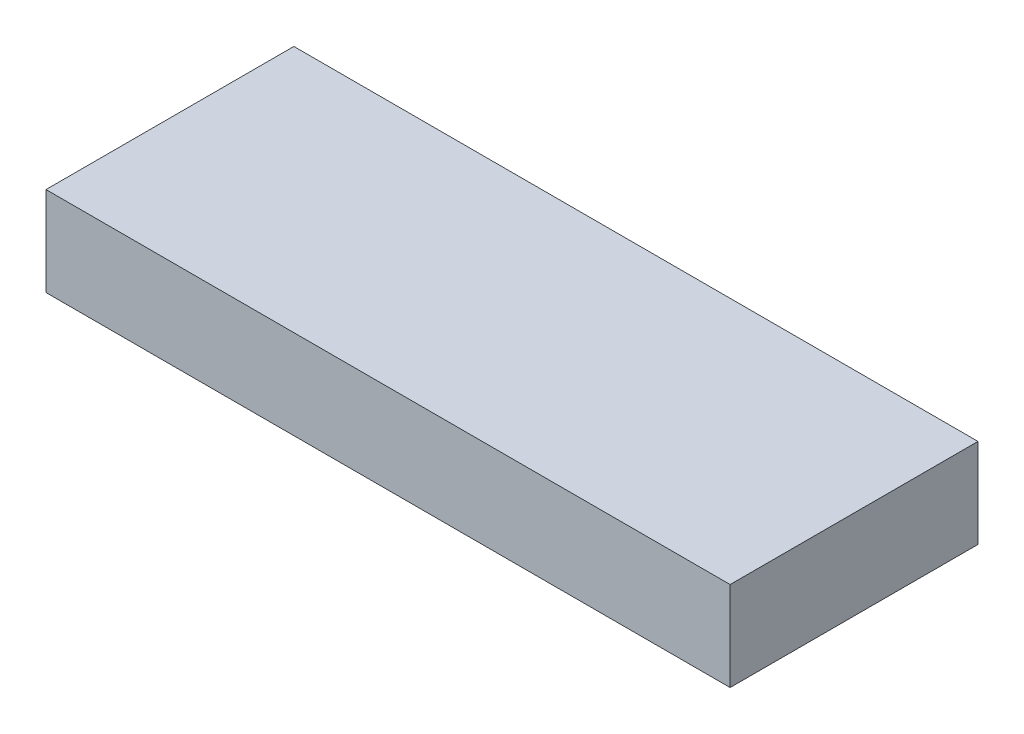
ISO-10303-21;
HEADER;
FILE_DESCRIPTION(('STEP AP214'),'2;1');
FILE_NAME('part.step','',(''),(''),'','','');
FILE_SCHEMA(('AUTOMOTIVE_DESIGN { 1 0 10303 214 1 1 1 1 }'));
ENDSEC;
DATA;
#1=APPLICATION_CONTEXT('core data for automotive mechanical design processes');
#2=APPLICATION_PROTOCOL_DEFINITION('international standard','automotive_design',2000,#1);
#3=PRODUCT_CONTEXT('',#1,'mechanical');
#4=PRODUCT('Part','Part','',(#3));
#5=PRODUCT_RELATED_PRODUCT_CATEGORY('part','',(#4));
#6=PRODUCT_DEFINITION_FORMATION('','',#4);
#7=PRODUCT_DEFINITION_CONTEXT('part definition',#1,'design');
#8=PRODUCT_DEFINITION('design','',#6,#7);
#9=PRODUCT_DEFINITION_SHAPE('','',#8);
#10=(LENGTH_UNIT() NAMED_UNIT(*) SI_UNIT(.MILLI.,.METRE.));
#11=(NAMED_UNIT(*) PLANE_ANGLE_UNIT() SI_UNIT($,.RADIAN.));
#12=(NAMED_UNIT(*) SI_UNIT($,.STERADIAN.) SOLID_ANGLE_UNIT());
#13=UNCERTAINTY_MEASURE_WITH_UNIT(LENGTH_MEASURE(1.E-05),#10,'distance_accuracy_value','');
#14=(GEOMETRIC_REPRESENTATION_CONTEXT(3) GLOBAL_UNCERTAINTY_ASSIGNED_CONTEXT((#13)) GLOBAL_UNIT_ASSIGNED_CONTEXT((#10,
#11,#12)) REPRESENTATION_CONTEXT('',''));
#15=CARTESIAN_POINT('',(0.,0.,0.));
#16=DIRECTION('',(0.,0.,1.));
#17=DIRECTION('',(1.,0.,0.));
#18=AXIS2_PLACEMENT_3D('',#15,#16,#17);
#19=CARTESIAN_POINT('',(17.25,4.5,6.25));
#20=DIRECTION('',(-1.,0.,0.));
#21=DIRECTION('',(0.,0.,1.));
#22=AXIS2_PLACEMENT_3D('',#19,#20,#21);
#23=PLANE('',#22);
#24=DIRECTION('',(0.,0.,-1.));
#25=VECTOR('',#24,1.);
#26=CARTESIAN_POINT('',(17.25,0.,6.25));
#27=LINE('',#26,#25);
#28=CARTESIAN_POINT('',(17.25,0.,6.25));
#29=VERTEX_POINT('',#28);
#30=CARTESIAN_POINT('',(17.25,0.,-6.25));
#31=VERTEX_POINT('',#30);
#32=EDGE_CURVE('E110',#29,#31,#27,.T.);
#33=ORIENTED_EDGE('',*,*,#32,.T.);
#34=DIRECTION('',(0.,-1.,0.));
#35=VECTOR('',#34,1.);
#36=CARTESIAN_POINT('',(17.25,4.5,-6.25));
#37=LINE('',#36,#35);
#38=CARTESIAN_POINT('',(17.25,4.5,-6.25));
#39=VERTEX_POINT('',#38);
#40=EDGE_CURVE('E11',#39,#31,#37,.T.);
#41=ORIENTED_EDGE('',*,*,#40,.F.);
#42=DIRECTION('',(0.,0.,-1.));
#43=VECTOR('',#42,1.);
#44=CARTESIAN_POINT('',(17.25,4.5,6.25));
#45=LINE('',#44,#43);
#46=CARTESIAN_POINT('',(17.25,4.5,6.25));
#47=VERTEX_POINT('',#46);
#48=EDGE_CURVE('E94',#47,#39,#45,.T.);
#49=ORIENTED_EDGE('',*,*,#48,.F.);
#50=DIRECTION('',(0.,-1.,0.));
#51=VECTOR('',#50,1.);
#52=CARTESIAN_POINT('',(17.25,4.5,6.25));
#53=LINE('',#52,#51);
#54=EDGE_CURVE('E106',#47,#29,#53,.T.);
#55=ORIENTED_EDGE('',*,*,#54,.T.);
#56=EDGE_LOOP('',(#33,#41,#49,#55));
#57=FACE_BOUND('',#56,.T.);
#58=ADVANCED_FACE('F42',(#57),#23,.F.);
#59=CARTESIAN_POINT('',(-17.25,4.5,-6.25));
#60=DIRECTION('',(0.,0.,1.));
#61=DIRECTION('',(1.,0.,0.));
#62=AXIS2_PLACEMENT_3D('',#59,#60,#61);
#63=PLANE('',#62);
#64=DIRECTION('',(-1.,0.,0.));
#65=VECTOR('',#64,1.);
#66=CARTESIAN_POINT('',(-17.25,0.,-6.25));
#67=LINE('',#66,#65);
#68=CARTESIAN_POINT('',(-17.25,0.,-6.25));
#69=VERTEX_POINT('',#68);
#70=EDGE_CURVE('E99',#31,#69,#67,.T.);
#71=ORIENTED_EDGE('',*,*,#70,.T.);
#72=DIRECTION('',(0.,-1.,0.));
#73=VECTOR('',#72,1.);
#74=CARTESIAN_POINT('',(-17.25,4.5,-6.25));
#75=LINE('',#74,#73);
#76=CARTESIAN_POINT('',(-17.25,4.5,-6.25));
#77=VERTEX_POINT('',#76);
#78=EDGE_CURVE('E51',#77,#69,#75,.T.);
#79=ORIENTED_EDGE('',*,*,#78,.F.);
#80=DIRECTION('',(-1.,0.,0.));
#81=VECTOR('',#80,1.);
#82=CARTESIAN_POINT('',(-17.25,4.5,-6.25));
#83=LINE('',#82,#81);
#84=EDGE_CURVE('E89',#39,#77,#83,.T.);
#85=ORIENTED_EDGE('',*,*,#84,.F.);
#86=ORIENTED_EDGE('',*,*,#40,.T.);
#87=EDGE_LOOP('',(#71,#79,#85,#86));
#88=FACE_BOUND('',#87,.T.);
#89=ADVANCED_FACE('F98',(#88),#63,.F.);
#90=CARTESIAN_POINT('',(-17.25,4.5,6.25));
#91=DIRECTION('',(1.,0.,0.));
#92=DIRECTION('',(0.,0.,-1.));
#93=AXIS2_PLACEMENT_3D('',#90,#91,#92);
#94=PLANE('',#93);
#95=DIRECTION('',(0.,0.,1.));
#96=VECTOR('',#95,1.);
#97=CARTESIAN_POINT('',(-17.25,0.,6.25));
#98=LINE('',#97,#96);
#99=CARTESIAN_POINT('',(-17.25,0.,6.25));
#100=VERTEX_POINT('',#99);
#101=EDGE_CURVE('E76',#69,#100,#98,.T.);
#102=ORIENTED_EDGE('',*,*,#101,.T.);
#103=DIRECTION('',(0.,-1.,0.));
#104=VECTOR('',#103,1.);
#105=CARTESIAN_POINT('',(-17.25,4.5,6.25));
#106=LINE('',#105,#104);
#107=CARTESIAN_POINT('',(-17.25,4.5,6.25));
#108=VERTEX_POINT('',#107);
#109=EDGE_CURVE('E101',#108,#100,#106,.T.);
#110=ORIENTED_EDGE('',*,*,#109,.F.);
#111=DIRECTION('',(0.,0.,1.));
#112=VECTOR('',#111,1.);
#113=CARTESIAN_POINT('',(-17.25,4.5,6.25));
#114=LINE('',#113,#112);
#115=EDGE_CURVE('E92',#77,#108,#114,.T.);
#116=ORIENTED_EDGE('',*,*,#115,.F.);
#117=ORIENTED_EDGE('',*,*,#78,.T.);
#118=EDGE_LOOP('',(#102,#110,#116,#117));
#119=FACE_BOUND('',#118,.T.);
#120=ADVANCED_FACE('F102',(#119),#94,.F.);
#121=CARTESIAN_POINT('',(-17.25,4.5,6.25));
#122=DIRECTION('',(0.,0.,-1.));
#123=DIRECTION('',(-1.,0.,0.));
#124=AXIS2_PLACEMENT_3D('',#121,#122,#123);
#125=PLANE('',#124);
#126=DIRECTION('',(1.,0.,0.));
#127=VECTOR('',#126,1.);
#128=CARTESIAN_POINT('',(-17.25,0.,6.25));
#129=LINE('',#128,#127);
#130=EDGE_CURVE('E82',#100,#29,#129,.T.);
#131=ORIENTED_EDGE('',*,*,#130,.T.);
#132=ORIENTED_EDGE('',*,*,#54,.F.);
#133=DIRECTION('',(1.,0.,0.));
#134=VECTOR('',#133,1.);
#135=CARTESIAN_POINT('',(-17.25,4.5,6.25));
#136=LINE('',#135,#134);
#137=EDGE_CURVE('E59',#108,#47,#136,.T.);
#138=ORIENTED_EDGE('',*,*,#137,.F.);
#139=ORIENTED_EDGE('',*,*,#109,.T.);
#140=EDGE_LOOP('',(#131,#132,#138,#139));
#141=FACE_BOUND('',#140,.T.);
#142=ADVANCED_FACE('F123',(#141),#125,.F.);
#143=CARTESIAN_POINT('',(0.,4.5,0.));
#144=DIRECTION('',(0.,-1.,0.));
#145=DIRECTION('',(0.,0.,-1.));
#146=AXIS2_PLACEMENT_3D('',#143,#144,#145);
#147=PLANE('',#146);
#148=ORIENTED_EDGE('',*,*,#48,.T.);
#149=ORIENTED_EDGE('',*,*,#84,.T.);
#150=ORIENTED_EDGE('',*,*,#115,.T.);
#151=ORIENTED_EDGE('',*,*,#137,.T.);
#152=EDGE_LOOP('',(#148,#149,#150,#151));
#153=FACE_BOUND('',#152,.T.);
#154=ADVANCED_FACE('F90',(#153),#147,.F.);
#155=CARTESIAN_POINT('',(0.,0.,0.));
#156=DIRECTION('',(0.,-1.,0.));
#157=DIRECTION('',(0.,0.,-1.));
#158=AXIS2_PLACEMENT_3D('',#155,#156,#157);
#159=PLANE('',#158);
#160=ORIENTED_EDGE('',*,*,#32,.F.);
#161=ORIENTED_EDGE('',*,*,#130,.F.);
#162=ORIENTED_EDGE('',*,*,#101,.F.);
#163=ORIENTED_EDGE('',*,*,#70,.F.);
#164=EDGE_LOOP('',(#160,#161,#162,#163));
#165=FACE_BOUND('',#164,.T.);
#166=ADVANCED_FACE('F126',(#165),#159,.T.);
#167=CLOSED_SHELL('',(#58,#89,#120,#142,#154,#166));
#168=MANIFOLD_SOLID_BREP('B2',#167);
#169=ADVANCED_BREP_SHAPE_REPRESENTATION('',(#18,#168),#14);
#170=SHAPE_DEFINITION_REPRESENTATION(#9,#169);
ENDSEC;
END-ISO-10303-21;
